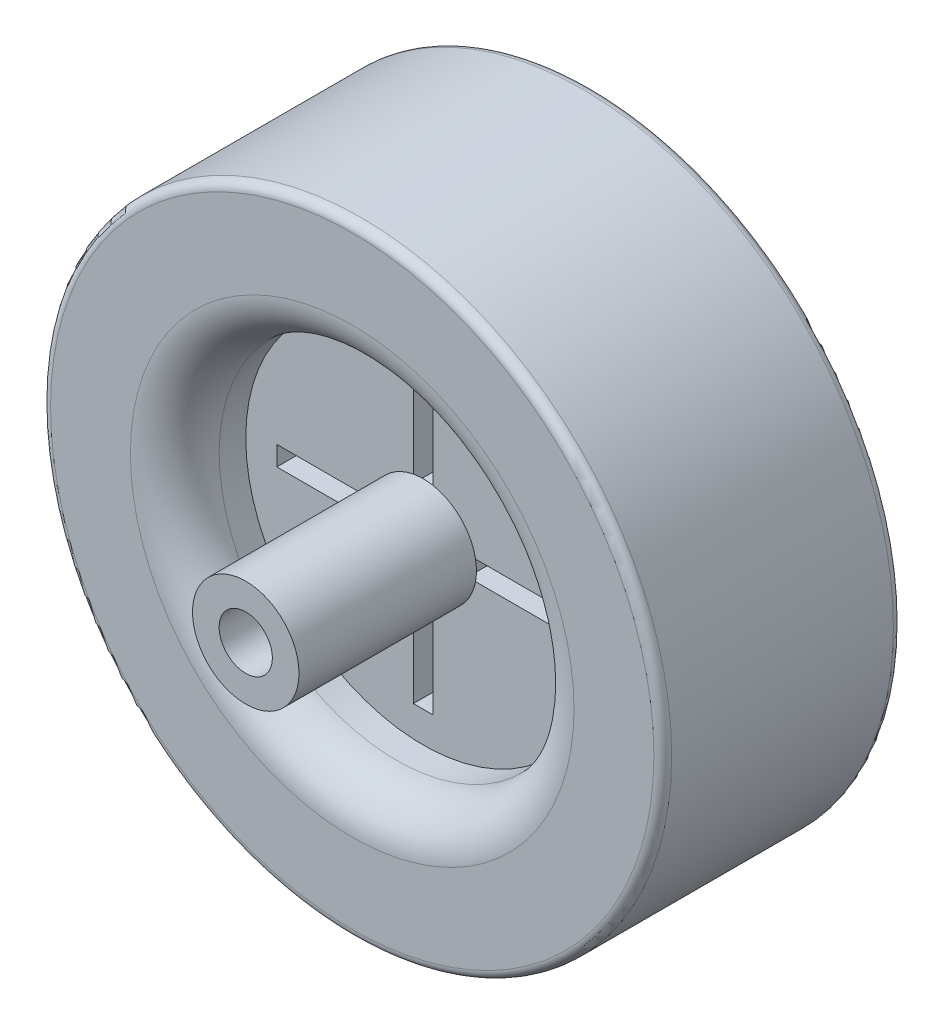
ISO-10303-21;
HEADER;
FILE_DESCRIPTION(('STEP AP214'),'2;1');
FILE_NAME('part.step','',(''),(''),'','','');
FILE_SCHEMA(('AUTOMOTIVE_DESIGN { 1 0 10303 214 1 1 1 1 }'));
ENDSEC;
DATA;
#1=APPLICATION_CONTEXT('core data for automotive mechanical design processes');
#2=APPLICATION_PROTOCOL_DEFINITION('international standard','automotive_design',2000,#1);
#3=PRODUCT_CONTEXT('',#1,'mechanical');
#4=PRODUCT('Part','Part','',(#3));
#5=PRODUCT_RELATED_PRODUCT_CATEGORY('part','',(#4));
#6=PRODUCT_DEFINITION_FORMATION('','',#4);
#7=PRODUCT_DEFINITION_CONTEXT('part definition',#1,'design');
#8=PRODUCT_DEFINITION('design','',#6,#7);
#9=PRODUCT_DEFINITION_SHAPE('','',#8);
#10=(LENGTH_UNIT() NAMED_UNIT(*) SI_UNIT(.MILLI.,.METRE.));
#11=(NAMED_UNIT(*) PLANE_ANGLE_UNIT() SI_UNIT($,.RADIAN.));
#12=(NAMED_UNIT(*) SI_UNIT($,.STERADIAN.) SOLID_ANGLE_UNIT());
#13=UNCERTAINTY_MEASURE_WITH_UNIT(LENGTH_MEASURE(1.E-05),#10,'distance_accuracy_value','');
#14=(GEOMETRIC_REPRESENTATION_CONTEXT(3) GLOBAL_UNCERTAINTY_ASSIGNED_CONTEXT((#13)) GLOBAL_UNIT_ASSIGNED_CONTEXT((#10,
#11,#12)) REPRESENTATION_CONTEXT('',''));
#15=CARTESIAN_POINT('',(0.,0.,0.));
#16=DIRECTION('',(0.,0.,1.));
#17=DIRECTION('',(1.,0.,0.));
#18=AXIS2_PLACEMENT_3D('',#15,#16,#17);
#19=CARTESIAN_POINT('',(0.,0.,19.));
#20=DIRECTION('',(0.,0.,1.));
#21=DIRECTION('',(1.,0.,0.));
#22=AXIS2_PLACEMENT_3D('',#19,#20,#21);
#23=PLANE('',#22);
#24=CARTESIAN_POINT('',(0.,0.,19.));
#25=DIRECTION('',(0.,0.,1.));
#26=DIRECTION('',(1.,0.,0.));
#27=AXIS2_PLACEMENT_3D('',#24,#25,#26);
#28=CIRCLE('',#27,20.);
#29=CARTESIAN_POINT('',(20.,0.,19.));
#30=VERTEX_POINT('',#29);
#31=EDGE_CURVE('E335',#30,#30,#28,.T.);
#32=ORIENTED_EDGE('',*,*,#31,.T.);
#33=EDGE_LOOP('',(#32));
#34=FACE_BOUND('',#33,.T.);
#35=CARTESIAN_POINT('',(0.,0.,19.));
#36=DIRECTION('',(0.,0.,1.));
#37=DIRECTION('',(1.,0.,0.));
#38=AXIS2_PLACEMENT_3D('',#35,#36,#37);
#39=CIRCLE('',#38,6.);
#40=CARTESIAN_POINT('',(1.09999999999999,-5.89830484122345,19.));
#41=VERTEX_POINT('',#40);
#42=CARTESIAN_POINT('',(5.89830484122345,-1.10000000000001,19.));
#43=VERTEX_POINT('',#42);
#44=EDGE_CURVE('E203',#41,#43,#39,.T.);
#45=ORIENTED_EDGE('',*,*,#44,.F.);
#46=DIRECTION('',(0.,-1.,0.));
#47=VECTOR('',#46,1.);
#48=CARTESIAN_POINT('',(1.09999999999999,-16.5,19.));
#49=LINE('',#48,#47);
#50=CARTESIAN_POINT('',(1.09999999999999,-16.5,19.));
#51=VERTEX_POINT('',#50);
#52=EDGE_CURVE('E183',#41,#51,#49,.T.);
#53=ORIENTED_EDGE('',*,*,#52,.T.);
#54=DIRECTION('',(-1.,0.,0.));
#55=VECTOR('',#54,1.);
#56=CARTESIAN_POINT('',(1.09999999999999,-16.5,19.));
#57=LINE('',#56,#55);
#58=CARTESIAN_POINT('',(-1.1,-16.5,19.));
#59=VERTEX_POINT('',#58);
#60=EDGE_CURVE('E194',#51,#59,#57,.T.);
#61=ORIENTED_EDGE('',*,*,#60,.T.);
#62=DIRECTION('',(0.,1.,0.));
#63=VECTOR('',#62,1.);
#64=CARTESIAN_POINT('',(-1.1,-16.5,19.));
#65=LINE('',#64,#63);
#66=CARTESIAN_POINT('',(-1.1,-5.89830484122345,19.));
#67=VERTEX_POINT('',#66);
#68=EDGE_CURVE('E56',#59,#67,#65,.T.);
#69=ORIENTED_EDGE('',*,*,#68,.T.);
#70=CARTESIAN_POINT('',(-5.89830484122346,-1.09999999999995,19.));
#71=VERTEX_POINT('',#70);
#72=EDGE_CURVE('E480',#71,#67,#39,.T.);
#73=ORIENTED_EDGE('',*,*,#72,.F.);
#74=DIRECTION('',(-1.,0.,0.));
#75=VECTOR('',#74,1.);
#76=CARTESIAN_POINT('',(-16.5,-1.09999999999983,19.));
#77=LINE('',#76,#75);
#78=CARTESIAN_POINT('',(-16.5,-1.09999999999983,19.));
#79=VERTEX_POINT('',#78);
#80=EDGE_CURVE('E235',#71,#79,#77,.T.);
#81=ORIENTED_EDGE('',*,*,#80,.T.);
#82=DIRECTION('',(0.,1.,0.));
#83=VECTOR('',#82,1.);
#84=CARTESIAN_POINT('',(-16.5,1.10000000000017,19.));
#85=LINE('',#84,#83);
#86=CARTESIAN_POINT('',(-16.5,1.10000000000017,19.));
#87=VERTEX_POINT('',#86);
#88=EDGE_CURVE('E64',#79,#87,#85,.T.);
#89=ORIENTED_EDGE('',*,*,#88,.T.);
#90=DIRECTION('',(1.,0.,0.));
#91=VECTOR('',#90,1.);
#92=CARTESIAN_POINT('',(-16.5,1.10000000000017,19.));
#93=LINE('',#92,#91);
#94=CARTESIAN_POINT('',(-5.89830484122344,1.10000000000005,19.));
#95=VERTEX_POINT('',#94);
#96=EDGE_CURVE('E228',#87,#95,#93,.T.);
#97=ORIENTED_EDGE('',*,*,#96,.T.);
#98=CARTESIAN_POINT('',(-1.1,5.89830484122345,19.));
#99=VERTEX_POINT('',#98);
#100=EDGE_CURVE('E477',#99,#95,#39,.T.);
#101=ORIENTED_EDGE('',*,*,#100,.F.);
#102=DIRECTION('',(0.,1.,0.));
#103=VECTOR('',#102,1.);
#104=CARTESIAN_POINT('',(-1.1,16.5,19.));
#105=LINE('',#104,#103);
#106=CARTESIAN_POINT('',(-1.1,16.5,19.));
#107=VERTEX_POINT('',#106);
#108=EDGE_CURVE('E267',#99,#107,#105,.T.);
#109=ORIENTED_EDGE('',*,*,#108,.T.);
#110=DIRECTION('',(1.,0.,0.));
#111=VECTOR('',#110,1.);
#112=CARTESIAN_POINT('',(1.09999999999999,16.5,19.));
#113=LINE('',#112,#111);
#114=CARTESIAN_POINT('',(1.09999999999999,16.5,19.));
#115=VERTEX_POINT('',#114);
#116=EDGE_CURVE('E271',#107,#115,#113,.T.);
#117=ORIENTED_EDGE('',*,*,#116,.T.);
#118=DIRECTION('',(0.,-1.,0.));
#119=VECTOR('',#118,1.);
#120=CARTESIAN_POINT('',(1.09999999999999,16.5,19.));
#121=LINE('',#120,#119);
#122=CARTESIAN_POINT('',(1.09999999999999,5.89830484122345,19.));
#123=VERTEX_POINT('',#122);
#124=EDGE_CURVE('E260',#115,#123,#121,.T.);
#125=ORIENTED_EDGE('',*,*,#124,.T.);
#126=CARTESIAN_POINT('',(5.89830484122346,1.09999999999998,19.));
#127=VERTEX_POINT('',#126);
#128=EDGE_CURVE('E336',#127,#123,#39,.T.);
#129=ORIENTED_EDGE('',*,*,#128,.F.);
#130=DIRECTION('',(1.,0.,0.));
#131=VECTOR('',#130,1.);
#132=CARTESIAN_POINT('',(16.5,1.09999999999995,19.));
#133=LINE('',#132,#131);
#134=CARTESIAN_POINT('',(16.5,1.09999999999995,19.));
#135=VERTEX_POINT('',#134);
#136=EDGE_CURVE('E300',#127,#135,#133,.T.);
#137=ORIENTED_EDGE('',*,*,#136,.T.);
#138=DIRECTION('',(0.,-1.,0.));
#139=VECTOR('',#138,1.);
#140=CARTESIAN_POINT('',(16.5,-1.10000000000005,19.));
#141=LINE('',#140,#139);
#142=CARTESIAN_POINT('',(16.5,-1.10000000000005,19.));
#143=VERTEX_POINT('',#142);
#144=EDGE_CURVE('E304',#135,#143,#141,.T.);
#145=ORIENTED_EDGE('',*,*,#144,.T.);
#146=DIRECTION('',(-1.,0.,0.));
#147=VECTOR('',#146,1.);
#148=CARTESIAN_POINT('',(16.5,-1.10000000000005,19.));
#149=LINE('',#148,#147);
#150=EDGE_CURVE('E294',#143,#43,#149,.T.);
#151=ORIENTED_EDGE('',*,*,#150,.T.);
#152=EDGE_LOOP('',(#45,#53,#61,#69,#73,#81,#89,#97,#101,#109,#117,#125,#129,#137,#145,#151));
#153=FACE_BOUND('',#152,.T.);
#154=ADVANCED_FACE('F41',(#34,#153),#23,.T.);
#155=CARTESIAN_POINT('',(0.,0.,27.));
#156=DIRECTION('',(0.,0.,-1.));
#157=DIRECTION('',(-1.,0.,0.));
#158=AXIS2_PLACEMENT_3D('',#155,#156,#157);
#159=CYLINDRICAL_SURFACE('',#158,35.);
#160=CARTESIAN_POINT('',(0.,0.,26.));
#161=DIRECTION('',(0.,0.,1.));
#162=DIRECTION('',(1.,0.,0.));
#163=AXIS2_PLACEMENT_3D('',#160,#161,#162);
#164=CIRCLE('',#163,35.);
#165=CARTESIAN_POINT('',(35.,0.,26.));
#166=VERTEX_POINT('',#165);
#167=EDGE_CURVE('E49',#166,#166,#164,.F.);
#168=ORIENTED_EDGE('',*,*,#167,.T.);
#169=EDGE_LOOP('',(#168));
#170=FACE_BOUND('',#169,.T.);
#171=CARTESIAN_POINT('',(0.,0.,1.));
#172=DIRECTION('',(0.,0.,1.));
#173=DIRECTION('',(1.,0.,0.));
#174=AXIS2_PLACEMENT_3D('',#171,#172,#173);
#175=CIRCLE('',#174,35.);
#176=CARTESIAN_POINT('',(35.,0.,1.));
#177=VERTEX_POINT('',#176);
#178=EDGE_CURVE('E357',#177,#177,#175,.T.);
#179=ORIENTED_EDGE('',*,*,#178,.T.);
#180=EDGE_LOOP('',(#179));
#181=FACE_BOUND('',#180,.T.);
#182=ADVANCED_FACE('F368',(#170,#181),#159,.T.);
#183=CARTESIAN_POINT('',(0.,0.,27.));
#184=DIRECTION('',(0.,0.,1.));
#185=DIRECTION('',(1.,0.,0.));
#186=AXIS2_PLACEMENT_3D('',#183,#184,#185);
#187=PLANE('',#186);
#188=CARTESIAN_POINT('',(0.,0.,27.));
#189=DIRECTION('',(0.,0.,1.));
#190=DIRECTION('',(1.,0.,0.));
#191=AXIS2_PLACEMENT_3D('',#188,#189,#190);
#192=CIRCLE('',#191,34.);
#193=CARTESIAN_POINT('',(34.,0.,27.));
#194=VERTEX_POINT('',#193);
#195=EDGE_CURVE('E363',#194,#194,#192,.T.);
#196=ORIENTED_EDGE('',*,*,#195,.T.);
#197=EDGE_LOOP('',(#196));
#198=FACE_BOUND('',#197,.T.);
#199=CARTESIAN_POINT('',(0.,0.,27.));
#200=DIRECTION('',(0.,0.,1.));
#201=DIRECTION('',(1.,0.,0.));
#202=AXIS2_PLACEMENT_3D('',#199,#200,#201);
#203=CIRCLE('',#202,25.);
#204=CARTESIAN_POINT('',(25.,0.,27.));
#205=VERTEX_POINT('',#204);
#206=EDGE_CURVE('E354',#205,#205,#203,.F.);
#207=ORIENTED_EDGE('',*,*,#206,.T.);
#208=EDGE_LOOP('',(#207));
#209=FACE_BOUND('',#208,.T.);
#210=ADVANCED_FACE('F378',(#198,#209),#187,.T.);
#211=CARTESIAN_POINT('',(0.,0.,0.));
#212=DIRECTION('',(0.,0.,1.));
#213=DIRECTION('',(1.,0.,0.));
#214=AXIS2_PLACEMENT_3D('',#211,#212,#213);
#215=PLANE('',#214);
#216=CARTESIAN_POINT('',(0.,0.,0.));
#217=DIRECTION('',(0.,0.,1.));
#218=DIRECTION('',(1.,0.,0.));
#219=AXIS2_PLACEMENT_3D('',#216,#217,#218);
#220=CIRCLE('',#219,34.);
#221=CARTESIAN_POINT('',(34.,0.,0.));
#222=VERTEX_POINT('',#221);
#223=EDGE_CURVE('E360',#222,#222,#220,.F.);
#224=ORIENTED_EDGE('',*,*,#223,.T.);
#225=EDGE_LOOP('',(#224));
#226=FACE_BOUND('',#225,.T.);
#227=CARTESIAN_POINT('',(0.,0.,0.));
#228=DIRECTION('',(0.,0.,1.));
#229=DIRECTION('',(1.,0.,0.));
#230=AXIS2_PLACEMENT_3D('',#227,#228,#229);
#231=CIRCLE('',#230,25.);
#232=CARTESIAN_POINT('',(25.,0.,0.));
#233=VERTEX_POINT('',#232);
#234=EDGE_CURVE('E348',#233,#233,#231,.T.);
#235=ORIENTED_EDGE('',*,*,#234,.T.);
#236=EDGE_LOOP('',(#235));
#237=FACE_BOUND('',#236,.T.);
#238=ADVANCED_FACE('F381',(#226,#237),#215,.F.);
#239=CARTESIAN_POINT('',(0.,0.,8.));
#240=DIRECTION('',(0.,0.,-1.));
#241=DIRECTION('',(-1.,0.,0.));
#242=AXIS2_PLACEMENT_3D('',#239,#240,#241);
#243=CYLINDRICAL_SURFACE('',#242,20.);
#244=CARTESIAN_POINT('',(0.,0.,5.));
#245=DIRECTION('',(0.,0.,1.));
#246=DIRECTION('',(1.,0.,0.));
#247=AXIS2_PLACEMENT_3D('',#244,#245,#246);
#248=CIRCLE('',#247,20.);
#249=CARTESIAN_POINT('',(20.,0.,5.));
#250=VERTEX_POINT('',#249);
#251=EDGE_CURVE('E345',#250,#250,#248,.F.);
#252=ORIENTED_EDGE('',*,*,#251,.T.);
#253=EDGE_LOOP('',(#252));
#254=FACE_BOUND('',#253,.T.);
#255=CARTESIAN_POINT('',(0.,0.,8.));
#256=DIRECTION('',(0.,0.,-1.));
#257=DIRECTION('',(-1.,0.,0.));
#258=AXIS2_PLACEMENT_3D('',#255,#256,#257);
#259=CIRCLE('',#258,20.);
#260=CARTESIAN_POINT('',(-20.,0.,8.));
#261=VERTEX_POINT('',#260);
#262=EDGE_CURVE('E342',#261,#261,#259,.T.);
#263=ORIENTED_EDGE('',*,*,#262,.F.);
#264=EDGE_LOOP('',(#263));
#265=FACE_BOUND('',#264,.T.);
#266=ADVANCED_FACE('F412',(#254,#265),#243,.F.);
#267=CARTESIAN_POINT('',(0.,0.,8.));
#268=DIRECTION('',(0.,0.,-1.));
#269=DIRECTION('',(-1.,0.,0.));
#270=AXIS2_PLACEMENT_3D('',#267,#268,#269);
#271=PLANE('',#270);
#272=CARTESIAN_POINT('',(0.,0.,8.));
#273=DIRECTION('',(0.,0.,-1.));
#274=DIRECTION('',(-1.,0.,0.));
#275=AXIS2_PLACEMENT_3D('',#272,#273,#274);
#276=CIRCLE('',#275,2.);
#277=CARTESIAN_POINT('',(-2.,0.,8.));
#278=VERTEX_POINT('',#277);
#279=EDGE_CURVE('E211',#278,#278,#276,.T.);
#280=ORIENTED_EDGE('',*,*,#279,.F.);
#281=EDGE_LOOP('',(#280));
#282=FACE_BOUND('',#281,.T.);
#283=DIRECTION('',(0.,-1.,0.));
#284=VECTOR('',#283,1.);
#285=CARTESIAN_POINT('',(1.09999999999999,-16.5,8.));
#286=LINE('',#285,#284);
#287=CARTESIAN_POINT('',(1.09999999999999,-5.,8.));
#288=VERTEX_POINT('',#287);
#289=CARTESIAN_POINT('',(1.09999999999999,-16.5,8.));
#290=VERTEX_POINT('',#289);
#291=EDGE_CURVE('E186',#288,#290,#286,.T.);
#292=ORIENTED_EDGE('',*,*,#291,.F.);
#293=DIRECTION('',(1.,0.,0.));
#294=VECTOR('',#293,1.);
#295=CARTESIAN_POINT('',(1.09999999999999,-5.,8.));
#296=LINE('',#295,#294);
#297=CARTESIAN_POINT('',(-1.1,-5.,8.));
#298=VERTEX_POINT('',#297);
#299=EDGE_CURVE('E205',#298,#288,#296,.T.);
#300=ORIENTED_EDGE('',*,*,#299,.F.);
#301=DIRECTION('',(0.,1.,0.));
#302=VECTOR('',#301,1.);
#303=CARTESIAN_POINT('',(-1.1,-16.5,8.));
#304=LINE('',#303,#302);
#305=CARTESIAN_POINT('',(-1.1,-16.5,8.));
#306=VERTEX_POINT('',#305);
#307=EDGE_CURVE('E208',#306,#298,#304,.T.);
#308=ORIENTED_EDGE('',*,*,#307,.F.);
#309=DIRECTION('',(-1.,0.,0.));
#310=VECTOR('',#309,1.);
#311=CARTESIAN_POINT('',(1.09999999999999,-16.5,8.));
#312=LINE('',#311,#310);
#313=EDGE_CURVE('E217',#290,#306,#312,.T.);
#314=ORIENTED_EDGE('',*,*,#313,.F.);
#315=EDGE_LOOP('',(#292,#300,#308,#314));
#316=FACE_BOUND('',#315,.T.);
#317=DIRECTION('',(1.,0.,0.));
#318=VECTOR('',#317,1.);
#319=CARTESIAN_POINT('',(-16.5,1.10000000000017,8.));
#320=LINE('',#319,#318);
#321=CARTESIAN_POINT('',(-16.5,1.10000000000017,8.));
#322=VERTEX_POINT('',#321);
#323=CARTESIAN_POINT('',(-4.99999999999999,1.10000000000005,8.));
#324=VERTEX_POINT('',#323);
#325=EDGE_CURVE('E241',#322,#324,#320,.T.);
#326=ORIENTED_EDGE('',*,*,#325,.F.);
#327=DIRECTION('',(0.,1.,0.));
#328=VECTOR('',#327,1.);
#329=CARTESIAN_POINT('',(-16.5,1.10000000000017,8.));
#330=LINE('',#329,#328);
#331=CARTESIAN_POINT('',(-16.5,-1.09999999999983,8.));
#332=VERTEX_POINT('',#331);
#333=EDGE_CURVE('E250',#332,#322,#330,.T.);
#334=ORIENTED_EDGE('',*,*,#333,.F.);
#335=DIRECTION('',(-1.,0.,0.));
#336=VECTOR('',#335,1.);
#337=CARTESIAN_POINT('',(-16.5,-1.09999999999983,8.));
#338=LINE('',#337,#336);
#339=CARTESIAN_POINT('',(-5.00000000000002,-1.09999999999996,8.));
#340=VERTEX_POINT('',#339);
#341=EDGE_CURVE('E247',#340,#332,#338,.T.);
#342=ORIENTED_EDGE('',*,*,#341,.F.);
#343=DIRECTION('',(0.,-1.,0.));
#344=VECTOR('',#343,1.);
#345=CARTESIAN_POINT('',(-4.99999999999999,1.10000000000005,8.));
#346=LINE('',#345,#344);
#347=EDGE_CURVE('E243',#324,#340,#346,.T.);
#348=ORIENTED_EDGE('',*,*,#347,.F.);
#349=EDGE_LOOP('',(#326,#334,#342,#348));
#350=FACE_BOUND('',#349,.T.);
#351=DIRECTION('',(0.,-1.,0.));
#352=VECTOR('',#351,1.);
#353=CARTESIAN_POINT('',(1.09999999999999,16.5,8.));
#354=LINE('',#353,#352);
#355=CARTESIAN_POINT('',(1.09999999999999,16.5,8.));
#356=VERTEX_POINT('',#355);
#357=CARTESIAN_POINT('',(1.09999999999999,5.,8.));
#358=VERTEX_POINT('',#357);
#359=EDGE_CURVE('E275',#356,#358,#354,.T.);
#360=ORIENTED_EDGE('',*,*,#359,.F.);
#361=DIRECTION('',(1.,0.,0.));
#362=VECTOR('',#361,1.);
#363=CARTESIAN_POINT('',(1.09999999999999,16.5,8.));
#364=LINE('',#363,#362);
#365=CARTESIAN_POINT('',(-1.1,16.5,8.));
#366=VERTEX_POINT('',#365);
#367=EDGE_CURVE('E284',#366,#356,#364,.T.);
#368=ORIENTED_EDGE('',*,*,#367,.F.);
#369=DIRECTION('',(0.,1.,0.));
#370=VECTOR('',#369,1.);
#371=CARTESIAN_POINT('',(-1.1,16.5,8.));
#372=LINE('',#371,#370);
#373=CARTESIAN_POINT('',(-1.1,5.,8.));
#374=VERTEX_POINT('',#373);
#375=EDGE_CURVE('E281',#374,#366,#372,.T.);
#376=ORIENTED_EDGE('',*,*,#375,.F.);
#377=DIRECTION('',(-1.,0.,0.));
#378=VECTOR('',#377,1.);
#379=CARTESIAN_POINT('',(1.09999999999999,5.,8.));
#380=LINE('',#379,#378);
#381=EDGE_CURVE('E277',#358,#374,#380,.T.);
#382=ORIENTED_EDGE('',*,*,#381,.F.);
#383=EDGE_LOOP('',(#360,#368,#376,#382));
#384=FACE_BOUND('',#383,.T.);
#385=DIRECTION('',(-1.,0.,0.));
#386=VECTOR('',#385,1.);
#387=CARTESIAN_POINT('',(16.5,-1.10000000000005,8.));
#388=LINE('',#387,#386);
#389=CARTESIAN_POINT('',(16.5,-1.10000000000005,8.));
#390=VERTEX_POINT('',#389);
#391=CARTESIAN_POINT('',(5.,-1.10000000000001,8.));
#392=VERTEX_POINT('',#391);
#393=EDGE_CURVE('E308',#390,#392,#388,.T.);
#394=ORIENTED_EDGE('',*,*,#393,.F.);
#395=DIRECTION('',(0.,-1.,0.));
#396=VECTOR('',#395,1.);
#397=CARTESIAN_POINT('',(16.5,-1.10000000000005,8.));
#398=LINE('',#397,#396);
#399=CARTESIAN_POINT('',(16.5,1.09999999999995,8.));
#400=VERTEX_POINT('',#399);
#401=EDGE_CURVE('E316',#400,#390,#398,.T.);
#402=ORIENTED_EDGE('',*,*,#401,.F.);
#403=DIRECTION('',(1.,0.,0.));
#404=VECTOR('',#403,1.);
#405=CARTESIAN_POINT('',(16.5,1.09999999999995,8.));
#406=LINE('',#405,#404);
#407=CARTESIAN_POINT('',(5.00000000000001,1.09999999999999,8.));
#408=VERTEX_POINT('',#407);
#409=EDGE_CURVE('E313',#408,#400,#406,.T.);
#410=ORIENTED_EDGE('',*,*,#409,.F.);
#411=DIRECTION('',(0.,1.,0.));
#412=VECTOR('',#411,1.);
#413=CARTESIAN_POINT('',(5.,-1.10000000000001,8.));
#414=LINE('',#413,#412);
#415=EDGE_CURVE('E310',#392,#408,#414,.T.);
#416=ORIENTED_EDGE('',*,*,#415,.F.);
#417=EDGE_LOOP('',(#394,#402,#410,#416));
#418=FACE_BOUND('',#417,.T.);
#419=ORIENTED_EDGE('',*,*,#262,.T.);
#420=EDGE_LOOP('',(#419));
#421=FACE_BOUND('',#420,.T.);
#422=ADVANCED_FACE('F396',(#282,#316,#350,#384,#418,#421),#271,.T.);
#423=CARTESIAN_POINT('',(0.,0.,19.));
#424=DIRECTION('',(0.,0.,1.));
#425=DIRECTION('',(1.,0.,0.));
#426=AXIS2_PLACEMENT_3D('',#423,#424,#425);
#427=CYLINDRICAL_SURFACE('',#426,20.);
#428=CARTESIAN_POINT('',(0.,0.,22.));
#429=DIRECTION('',(0.,0.,1.));
#430=DIRECTION('',(1.,0.,0.));
#431=AXIS2_PLACEMENT_3D('',#428,#429,#430);
#432=CIRCLE('',#431,20.);
#433=CARTESIAN_POINT('',(20.,0.,22.));
#434=VERTEX_POINT('',#433);
#435=EDGE_CURVE('E351',#434,#434,#432,.T.);
#436=ORIENTED_EDGE('',*,*,#435,.T.);
#437=EDGE_LOOP('',(#436));
#438=FACE_BOUND('',#437,.T.);
#439=ORIENTED_EDGE('',*,*,#31,.F.);
#440=EDGE_LOOP('',(#439));
#441=FACE_BOUND('',#440,.T.);
#442=ADVANCED_FACE('F393',(#438,#441),#427,.F.);
#443=CARTESIAN_POINT('',(0.,0.,5.));
#444=DIRECTION('',(0.,0.,1.));
#445=DIRECTION('',(1.,0.,0.));
#446=AXIS2_PLACEMENT_3D('',#443,#444,#445);
#447=TOROIDAL_SURFACE('',#446,25.,5.);
#448=ORIENTED_EDGE('',*,*,#234,.F.);
#449=EDGE_LOOP('',(#448));
#450=FACE_BOUND('',#449,.T.);
#451=ORIENTED_EDGE('',*,*,#251,.F.);
#452=EDGE_LOOP('',(#451));
#453=FACE_BOUND('',#452,.T.);
#454=ADVANCED_FACE('F389',(#450,#453),#447,.T.);
#455=CARTESIAN_POINT('',(0.,0.,22.));
#456=DIRECTION('',(0.,0.,1.));
#457=DIRECTION('',(1.,0.,0.));
#458=AXIS2_PLACEMENT_3D('',#455,#456,#457);
#459=TOROIDAL_SURFACE('',#458,25.,5.);
#460=ORIENTED_EDGE('',*,*,#206,.F.);
#461=EDGE_LOOP('',(#460));
#462=FACE_BOUND('',#461,.T.);
#463=ORIENTED_EDGE('',*,*,#435,.F.);
#464=EDGE_LOOP('',(#463));
#465=FACE_BOUND('',#464,.T.);
#466=ADVANCED_FACE('F385',(#462,#465),#459,.T.);
#467=CARTESIAN_POINT('',(0.,0.,39.));
#468=DIRECTION('',(0.,0.,-1.));
#469=DIRECTION('',(-1.,0.,0.));
#470=AXIS2_PLACEMENT_3D('',#467,#468,#469);
#471=CYLINDRICAL_SURFACE('',#470,6.);
#472=CARTESIAN_POINT('',(0.,0.,39.));
#473=DIRECTION('',(0.,0.,1.));
#474=DIRECTION('',(1.,0.,0.));
#475=AXIS2_PLACEMENT_3D('',#472,#473,#474);
#476=CIRCLE('',#475,6.);
#477=CARTESIAN_POINT('',(6.,0.,39.));
#478=VERTEX_POINT('',#477);
#479=EDGE_CURVE('E332',#478,#478,#476,.T.);
#480=ORIENTED_EDGE('',*,*,#479,.F.);
#481=EDGE_LOOP('',(#480));
#482=FACE_BOUND('',#481,.T.);
#483=ORIENTED_EDGE('',*,*,#128,.T.);
#484=EDGE_CURVE('E339',#123,#99,#39,.T.);
#485=ORIENTED_EDGE('',*,*,#484,.T.);
#486=ORIENTED_EDGE('',*,*,#100,.T.);
#487=EDGE_CURVE('E478',#95,#71,#39,.T.);
#488=ORIENTED_EDGE('',*,*,#487,.T.);
#489=ORIENTED_EDGE('',*,*,#72,.T.);
#490=EDGE_CURVE('E482',#67,#41,#39,.T.);
#491=ORIENTED_EDGE('',*,*,#490,.T.);
#492=ORIENTED_EDGE('',*,*,#44,.T.);
#493=EDGE_CURVE('E329',#43,#127,#39,.T.);
#494=ORIENTED_EDGE('',*,*,#493,.T.);
#495=EDGE_LOOP('',(#483,#485,#486,#488,#489,#491,#492,#494));
#496=FACE_BOUND('',#495,.T.);
#497=ADVANCED_FACE('F388',(#482,#496),#471,.T.);
#498=CARTESIAN_POINT('',(0.,0.,39.));
#499=DIRECTION('',(0.,0.,1.));
#500=DIRECTION('',(1.,0.,0.));
#501=AXIS2_PLACEMENT_3D('',#498,#499,#500);
#502=PLANE('',#501);
#503=CARTESIAN_POINT('',(0.,0.,39.));
#504=DIRECTION('',(0.,0.,1.));
#505=DIRECTION('',(1.,0.,0.));
#506=AXIS2_PLACEMENT_3D('',#503,#504,#505);
#507=CIRCLE('',#506,3.);
#508=CARTESIAN_POINT('',(3.,0.,39.));
#509=VERTEX_POINT('',#508);
#510=EDGE_CURVE('E224',#509,#509,#507,.T.);
#511=ORIENTED_EDGE('',*,*,#510,.F.);
#512=EDGE_LOOP('',(#511));
#513=FACE_BOUND('',#512,.T.);
#514=ORIENTED_EDGE('',*,*,#479,.T.);
#515=EDGE_LOOP('',(#514));
#516=FACE_BOUND('',#515,.T.);
#517=ADVANCED_FACE('F446',(#513,#516),#502,.T.);
#518=CARTESIAN_POINT('',(0.,0.,33.));
#519=DIRECTION('',(0.,0.,1.));
#520=DIRECTION('',(1.,0.,0.));
#521=AXIS2_PLACEMENT_3D('',#518,#519,#520);
#522=CYLINDRICAL_SURFACE('',#521,3.);
#523=CARTESIAN_POINT('',(0.,0.,33.));
#524=DIRECTION('',(0.,0.,1.));
#525=DIRECTION('',(1.,0.,0.));
#526=AXIS2_PLACEMENT_3D('',#523,#524,#525);
#527=CIRCLE('',#526,3.);
#528=CARTESIAN_POINT('',(3.,0.,33.));
#529=VERTEX_POINT('',#528);
#530=EDGE_CURVE('E326',#529,#529,#527,.T.);
#531=ORIENTED_EDGE('',*,*,#530,.F.);
#532=EDGE_LOOP('',(#531));
#533=FACE_BOUND('',#532,.T.);
#534=ORIENTED_EDGE('',*,*,#510,.T.);
#535=EDGE_LOOP('',(#534));
#536=FACE_BOUND('',#535,.T.);
#537=ADVANCED_FACE('F430',(#533,#536),#522,.F.);
#538=CARTESIAN_POINT('',(0.,0.,33.));
#539=DIRECTION('',(0.,0.,1.));
#540=DIRECTION('',(1.,0.,0.));
#541=AXIS2_PLACEMENT_3D('',#538,#539,#540);
#542=PLANE('',#541);
#543=ORIENTED_EDGE('',*,*,#530,.T.);
#544=EDGE_LOOP('',(#543));
#545=FACE_BOUND('',#544,.T.);
#546=ADVANCED_FACE('F424',(#545),#542,.T.);
#547=CARTESIAN_POINT('',(0.,0.,1.));
#548=DIRECTION('',(0.,0.,1.));
#549=DIRECTION('',(1.,0.,0.));
#550=AXIS2_PLACEMENT_3D('',#547,#548,#549);
#551=TOROIDAL_SURFACE('',#550,34.,1.);
#552=ORIENTED_EDGE('',*,*,#223,.F.);
#553=EDGE_LOOP('',(#552));
#554=FACE_BOUND('',#553,.T.);
#555=ORIENTED_EDGE('',*,*,#178,.F.);
#556=EDGE_LOOP('',(#555));
#557=FACE_BOUND('',#556,.T.);
#558=ADVANCED_FACE('F375',(#554,#557),#551,.T.);
#559=CARTESIAN_POINT('',(0.,0.,26.));
#560=DIRECTION('',(0.,0.,1.));
#561=DIRECTION('',(1.,0.,0.));
#562=AXIS2_PLACEMENT_3D('',#559,#560,#561);
#563=TOROIDAL_SURFACE('',#562,34.,1.);
#564=ORIENTED_EDGE('',*,*,#167,.F.);
#565=EDGE_LOOP('',(#564));
#566=FACE_BOUND('',#565,.T.);
#567=ORIENTED_EDGE('',*,*,#195,.F.);
#568=EDGE_LOOP('',(#567));
#569=FACE_BOUND('',#568,.T.);
#570=ADVANCED_FACE('F371',(#566,#569),#563,.T.);
#571=CARTESIAN_POINT('',(16.5,-1.10000000000005,19.));
#572=DIRECTION('',(0.,-1.,0.));
#573=DIRECTION('',(1.,0.,0.));
#574=AXIS2_PLACEMENT_3D('',#571,#572,#573);
#575=PLANE('',#574);
#576=ORIENTED_EDGE('',*,*,#393,.T.);
#577=DIRECTION('',(0.,0.,-1.));
#578=VECTOR('',#577,1.);
#579=CARTESIAN_POINT('',(5.,-1.10000000000001,19.));
#580=LINE('',#579,#578);
#581=CARTESIAN_POINT('',(5.,-1.10000000000001,19.));
#582=VERTEX_POINT('',#581);
#583=EDGE_CURVE('E307',#582,#392,#580,.T.);
#584=ORIENTED_EDGE('',*,*,#583,.F.);
#585=EDGE_CURVE('E297',#43,#582,#149,.T.);
#586=ORIENTED_EDGE('',*,*,#585,.F.);
#587=ORIENTED_EDGE('',*,*,#150,.F.);
#588=DIRECTION('',(0.,0.,-1.));
#589=VECTOR('',#588,1.);
#590=CARTESIAN_POINT('',(16.5,-1.10000000000005,19.));
#591=LINE('',#590,#589);
#592=EDGE_CURVE('E278',#143,#390,#591,.T.);
#593=ORIENTED_EDGE('',*,*,#592,.T.);
#594=EDGE_LOOP('',(#576,#584,#586,#587,#593));
#595=FACE_BOUND('',#594,.T.);
#596=ADVANCED_FACE('F374',(#595),#575,.F.);
#597=CARTESIAN_POINT('',(16.5,-1.10000000000005,19.));
#598=DIRECTION('',(1.,0.,0.));
#599=DIRECTION('',(0.,1.,0.));
#600=AXIS2_PLACEMENT_3D('',#597,#598,#599);
#601=PLANE('',#600);
#602=ORIENTED_EDGE('',*,*,#401,.T.);
#603=ORIENTED_EDGE('',*,*,#592,.F.);
#604=ORIENTED_EDGE('',*,*,#144,.F.);
#605=DIRECTION('',(0.,0.,-1.));
#606=VECTOR('',#605,1.);
#607=CARTESIAN_POINT('',(16.5,1.09999999999995,19.));
#608=LINE('',#607,#606);
#609=EDGE_CURVE('E320',#135,#400,#608,.T.);
#610=ORIENTED_EDGE('',*,*,#609,.T.);
#611=EDGE_LOOP('',(#602,#603,#604,#610));
#612=FACE_BOUND('',#611,.T.);
#613=ADVANCED_FACE('F539',(#612),#601,.F.);
#614=CARTESIAN_POINT('',(16.5,1.09999999999995,19.));
#615=DIRECTION('',(0.,1.,0.));
#616=DIRECTION('',(-1.,0.,0.));
#617=AXIS2_PLACEMENT_3D('',#614,#615,#616);
#618=PLANE('',#617);
#619=ORIENTED_EDGE('',*,*,#409,.T.);
#620=ORIENTED_EDGE('',*,*,#609,.F.);
#621=ORIENTED_EDGE('',*,*,#136,.F.);
#622=CARTESIAN_POINT('',(5.00000000000001,1.09999999999999,19.));
#623=VERTEX_POINT('',#622);
#624=EDGE_CURVE('E301',#623,#127,#133,.T.);
#625=ORIENTED_EDGE('',*,*,#624,.F.);
#626=DIRECTION('',(0.,0.,-1.));
#627=VECTOR('',#626,1.);
#628=CARTESIAN_POINT('',(5.00000000000001,1.09999999999999,19.));
#629=LINE('',#628,#627);
#630=EDGE_CURVE('E322',#623,#408,#629,.T.);
#631=ORIENTED_EDGE('',*,*,#630,.T.);
#632=EDGE_LOOP('',(#619,#620,#621,#625,#631));
#633=FACE_BOUND('',#632,.T.);
#634=ADVANCED_FACE('F542',(#633),#618,.F.);
#635=CARTESIAN_POINT('',(5.,-1.10000000000001,19.));
#636=DIRECTION('',(-1.,0.,0.));
#637=DIRECTION('',(0.,-1.,0.));
#638=AXIS2_PLACEMENT_3D('',#635,#636,#637);
#639=PLANE('',#638);
#640=ORIENTED_EDGE('',*,*,#415,.T.);
#641=ORIENTED_EDGE('',*,*,#630,.F.);
#642=DIRECTION('',(0.,1.,0.));
#643=VECTOR('',#642,1.);
#644=CARTESIAN_POINT('',(5.,-1.10000000000001,19.));
#645=LINE('',#644,#643);
#646=EDGE_CURVE('E296',#582,#623,#645,.T.);
#647=ORIENTED_EDGE('',*,*,#646,.F.);
#648=ORIENTED_EDGE('',*,*,#583,.T.);
#649=EDGE_LOOP('',(#640,#641,#647,#648));
#650=FACE_BOUND('',#649,.T.);
#651=ADVANCED_FACE('F537',(#650),#639,.F.);
#652=CARTESIAN_POINT('',(0.,0.,19.));
#653=DIRECTION('',(0.,0.,-1.));
#654=DIRECTION('',(-1.,0.,0.));
#655=AXIS2_PLACEMENT_3D('',#652,#653,#654);
#656=PLANE('',#655);
#657=ORIENTED_EDGE('',*,*,#585,.T.);
#658=ORIENTED_EDGE('',*,*,#646,.T.);
#659=ORIENTED_EDGE('',*,*,#624,.T.);
#660=ORIENTED_EDGE('',*,*,#493,.F.);
#661=EDGE_LOOP('',(#657,#658,#659,#660));
#662=FACE_BOUND('',#661,.T.);
#663=ADVANCED_FACE('F534',(#662),#656,.T.);
#664=CARTESIAN_POINT('',(1.09999999999999,16.5,19.));
#665=DIRECTION('',(1.,0.,0.));
#666=DIRECTION('',(0.,0.,-1.));
#667=AXIS2_PLACEMENT_3D('',#664,#665,#666);
#668=PLANE('',#667);
#669=ORIENTED_EDGE('',*,*,#359,.T.);
#670=DIRECTION('',(0.,0.,-1.));
#671=VECTOR('',#670,1.);
#672=CARTESIAN_POINT('',(1.09999999999999,5.,19.));
#673=LINE('',#672,#671);
#674=CARTESIAN_POINT('',(1.09999999999999,5.,19.));
#675=VERTEX_POINT('',#674);
#676=EDGE_CURVE('E274',#675,#358,#673,.T.);
#677=ORIENTED_EDGE('',*,*,#676,.F.);
#678=EDGE_CURVE('E264',#123,#675,#121,.T.);
#679=ORIENTED_EDGE('',*,*,#678,.F.);
#680=ORIENTED_EDGE('',*,*,#124,.F.);
#681=DIRECTION('',(0.,0.,-1.));
#682=VECTOR('',#681,1.);
#683=CARTESIAN_POINT('',(1.09999999999999,16.5,19.));
#684=LINE('',#683,#682);
#685=EDGE_CURVE('E244',#115,#356,#684,.T.);
#686=ORIENTED_EDGE('',*,*,#685,.T.);
#687=EDGE_LOOP('',(#669,#677,#679,#680,#686));
#688=FACE_BOUND('',#687,.T.);
#689=ADVANCED_FACE('F470',(#688),#668,.F.);
#690=CARTESIAN_POINT('',(1.09999999999999,16.5,19.));
#691=DIRECTION('',(0.,1.,0.));
#692=DIRECTION('',(0.,0.,1.));
#693=AXIS2_PLACEMENT_3D('',#690,#691,#692);
#694=PLANE('',#693);
#695=ORIENTED_EDGE('',*,*,#367,.T.);
#696=ORIENTED_EDGE('',*,*,#685,.F.);
#697=ORIENTED_EDGE('',*,*,#116,.F.);
#698=DIRECTION('',(0.,0.,-1.));
#699=VECTOR('',#698,1.);
#700=CARTESIAN_POINT('',(-1.1,16.5,19.));
#701=LINE('',#700,#699);
#702=EDGE_CURVE('E288',#107,#366,#701,.T.);
#703=ORIENTED_EDGE('',*,*,#702,.T.);
#704=EDGE_LOOP('',(#695,#696,#697,#703));
#705=FACE_BOUND('',#704,.T.);
#706=ADVANCED_FACE('F516',(#705),#694,.F.);
#707=CARTESIAN_POINT('',(-1.1,16.5,19.));
#708=DIRECTION('',(-1.,0.,0.));
#709=DIRECTION('',(0.,0.,1.));
#710=AXIS2_PLACEMENT_3D('',#707,#708,#709);
#711=PLANE('',#710);
#712=ORIENTED_EDGE('',*,*,#375,.T.);
#713=ORIENTED_EDGE('',*,*,#702,.F.);
#714=ORIENTED_EDGE('',*,*,#108,.F.);
#715=CARTESIAN_POINT('',(-1.1,5.,19.));
#716=VERTEX_POINT('',#715);
#717=EDGE_CURVE('E268',#716,#99,#105,.T.);
#718=ORIENTED_EDGE('',*,*,#717,.F.);
#719=DIRECTION('',(0.,0.,-1.));
#720=VECTOR('',#719,1.);
#721=CARTESIAN_POINT('',(-1.1,5.,19.));
#722=LINE('',#721,#720);
#723=EDGE_CURVE('E290',#716,#374,#722,.T.);
#724=ORIENTED_EDGE('',*,*,#723,.T.);
#725=EDGE_LOOP('',(#712,#713,#714,#718,#724));
#726=FACE_BOUND('',#725,.T.);
#727=ADVANCED_FACE('F512',(#726),#711,.F.);
#728=CARTESIAN_POINT('',(1.09999999999999,5.,19.));
#729=DIRECTION('',(0.,-1.,0.));
#730=DIRECTION('',(0.,0.,-1.));
#731=AXIS2_PLACEMENT_3D('',#728,#729,#730);
#732=PLANE('',#731);
#733=ORIENTED_EDGE('',*,*,#381,.T.);
#734=ORIENTED_EDGE('',*,*,#723,.F.);
#735=DIRECTION('',(-1.,0.,0.));
#736=VECTOR('',#735,1.);
#737=CARTESIAN_POINT('',(1.09999999999999,5.,19.));
#738=LINE('',#737,#736);
#739=EDGE_CURVE('E263',#675,#716,#738,.T.);
#740=ORIENTED_EDGE('',*,*,#739,.F.);
#741=ORIENTED_EDGE('',*,*,#676,.T.);
#742=EDGE_LOOP('',(#733,#734,#740,#741));
#743=FACE_BOUND('',#742,.T.);
#744=ADVANCED_FACE('F521',(#743),#732,.F.);
#745=CARTESIAN_POINT('',(0.,0.,19.));
#746=DIRECTION('',(0.,0.,-1.));
#747=DIRECTION('',(-1.,0.,0.));
#748=AXIS2_PLACEMENT_3D('',#745,#746,#747);
#749=PLANE('',#748);
#750=ORIENTED_EDGE('',*,*,#678,.T.);
#751=ORIENTED_EDGE('',*,*,#739,.T.);
#752=ORIENTED_EDGE('',*,*,#717,.T.);
#753=ORIENTED_EDGE('',*,*,#484,.F.);
#754=EDGE_LOOP('',(#750,#751,#752,#753));
#755=FACE_BOUND('',#754,.T.);
#756=ADVANCED_FACE('F474',(#755),#749,.T.);
#757=CARTESIAN_POINT('',(-16.5,1.10000000000017,19.));
#758=DIRECTION('',(0.,1.,0.));
#759=DIRECTION('',(-1.,0.,0.));
#760=AXIS2_PLACEMENT_3D('',#757,#758,#759);
#761=PLANE('',#760);
#762=ORIENTED_EDGE('',*,*,#325,.T.);
#763=DIRECTION('',(0.,0.,-1.));
#764=VECTOR('',#763,1.);
#765=CARTESIAN_POINT('',(-4.99999999999999,1.10000000000005,19.));
#766=LINE('',#765,#764);
#767=CARTESIAN_POINT('',(-4.99999999999999,1.10000000000005,19.));
#768=VERTEX_POINT('',#767);
#769=EDGE_CURVE('E240',#768,#324,#766,.T.);
#770=ORIENTED_EDGE('',*,*,#769,.F.);
#771=EDGE_CURVE('E232',#95,#768,#93,.T.);
#772=ORIENTED_EDGE('',*,*,#771,.F.);
#773=ORIENTED_EDGE('',*,*,#96,.F.);
#774=DIRECTION('',(0.,0.,-1.));
#775=VECTOR('',#774,1.);
#776=CARTESIAN_POINT('',(-16.5,1.10000000000017,19.));
#777=LINE('',#776,#775);
#778=EDGE_CURVE('E218',#87,#322,#777,.T.);
#779=ORIENTED_EDGE('',*,*,#778,.T.);
#780=EDGE_LOOP('',(#762,#770,#772,#773,#779));
#781=FACE_BOUND('',#780,.T.);
#782=ADVANCED_FACE('F509',(#781),#761,.F.);
#783=CARTESIAN_POINT('',(-16.5,1.10000000000017,19.));
#784=DIRECTION('',(-1.,0.,0.));
#785=DIRECTION('',(0.,-1.,0.));
#786=AXIS2_PLACEMENT_3D('',#783,#784,#785);
#787=PLANE('',#786);
#788=ORIENTED_EDGE('',*,*,#333,.T.);
#789=ORIENTED_EDGE('',*,*,#778,.F.);
#790=ORIENTED_EDGE('',*,*,#88,.F.);
#791=DIRECTION('',(0.,0.,-1.));
#792=VECTOR('',#791,1.);
#793=CARTESIAN_POINT('',(-16.5,-1.09999999999983,19.));
#794=LINE('',#793,#792);
#795=EDGE_CURVE('E254',#79,#332,#794,.T.);
#796=ORIENTED_EDGE('',*,*,#795,.T.);
#797=EDGE_LOOP('',(#788,#789,#790,#796));
#798=FACE_BOUND('',#797,.T.);
#799=ADVANCED_FACE('F506',(#798),#787,.F.);
#800=CARTESIAN_POINT('',(-16.5,-1.09999999999983,19.));
#801=DIRECTION('',(0.,-1.,0.));
#802=DIRECTION('',(1.,0.,0.));
#803=AXIS2_PLACEMENT_3D('',#800,#801,#802);
#804=PLANE('',#803);
#805=ORIENTED_EDGE('',*,*,#341,.T.);
#806=ORIENTED_EDGE('',*,*,#795,.F.);
#807=ORIENTED_EDGE('',*,*,#80,.F.);
#808=CARTESIAN_POINT('',(-5.00000000000002,-1.09999999999996,19.));
#809=VERTEX_POINT('',#808);
#810=EDGE_CURVE('E236',#809,#71,#77,.T.);
#811=ORIENTED_EDGE('',*,*,#810,.F.);
#812=DIRECTION('',(0.,0.,-1.));
#813=VECTOR('',#812,1.);
#814=CARTESIAN_POINT('',(-5.00000000000002,-1.09999999999996,19.));
#815=LINE('',#814,#813);
#816=EDGE_CURVE('E256',#809,#340,#815,.T.);
#817=ORIENTED_EDGE('',*,*,#816,.T.);
#818=EDGE_LOOP('',(#805,#806,#807,#811,#817));
#819=FACE_BOUND('',#818,.T.);
#820=ADVANCED_FACE('F492',(#819),#804,.F.);
#821=CARTESIAN_POINT('',(-4.99999999999999,1.10000000000005,19.));
#822=DIRECTION('',(1.,0.,0.));
#823=DIRECTION('',(0.,1.,0.));
#824=AXIS2_PLACEMENT_3D('',#821,#822,#823);
#825=PLANE('',#824);
#826=ORIENTED_EDGE('',*,*,#347,.T.);
#827=ORIENTED_EDGE('',*,*,#816,.F.);
#828=DIRECTION('',(0.,-1.,0.));
#829=VECTOR('',#828,1.);
#830=CARTESIAN_POINT('',(-4.99999999999999,1.10000000000005,19.));
#831=LINE('',#830,#829);
#832=EDGE_CURVE('E231',#768,#809,#831,.T.);
#833=ORIENTED_EDGE('',*,*,#832,.F.);
#834=ORIENTED_EDGE('',*,*,#769,.T.);
#835=EDGE_LOOP('',(#826,#827,#833,#834));
#836=FACE_BOUND('',#835,.T.);
#837=ADVANCED_FACE('F499',(#836),#825,.F.);
#838=CARTESIAN_POINT('',(0.,0.,19.));
#839=DIRECTION('',(0.,0.,-1.));
#840=DIRECTION('',(-1.,0.,0.));
#841=AXIS2_PLACEMENT_3D('',#838,#839,#840);
#842=PLANE('',#841);
#843=ORIENTED_EDGE('',*,*,#771,.T.);
#844=ORIENTED_EDGE('',*,*,#832,.T.);
#845=ORIENTED_EDGE('',*,*,#810,.T.);
#846=ORIENTED_EDGE('',*,*,#487,.F.);
#847=EDGE_LOOP('',(#843,#844,#845,#846));
#848=FACE_BOUND('',#847,.T.);
#849=ADVANCED_FACE('F494',(#848),#842,.T.);
#850=CARTESIAN_POINT('',(0.,0.,19.));
#851=DIRECTION('',(0.,0.,1.));
#852=DIRECTION('',(1.,0.,0.));
#853=AXIS2_PLACEMENT_3D('',#850,#851,#852);
#854=PLANE('',#853);
#855=CARTESIAN_POINT('',(-1.1,-5.,19.));
#856=VERTEX_POINT('',#855);
#857=EDGE_CURVE('E197',#67,#856,#65,.T.);
#858=ORIENTED_EDGE('',*,*,#857,.T.);
#859=DIRECTION('',(1.,0.,0.));
#860=VECTOR('',#859,1.);
#861=CARTESIAN_POINT('',(1.09999999999999,-5.,19.));
#862=LINE('',#861,#860);
#863=CARTESIAN_POINT('',(1.09999999999999,-5.,19.));
#864=VERTEX_POINT('',#863);
#865=EDGE_CURVE('E191',#856,#864,#862,.T.);
#866=ORIENTED_EDGE('',*,*,#865,.T.);
#867=EDGE_CURVE('E198',#864,#41,#49,.T.);
#868=ORIENTED_EDGE('',*,*,#867,.T.);
#869=ORIENTED_EDGE('',*,*,#490,.F.);
#870=EDGE_LOOP('',(#858,#866,#868,#869));
#871=FACE_BOUND('',#870,.T.);
#872=ADVANCED_FACE('F485',(#871),#854,.F.);
#873=CARTESIAN_POINT('',(1.09999999999999,-16.5,19.));
#874=DIRECTION('',(1.,0.,0.));
#875=DIRECTION('',(0.,0.,-1.));
#876=AXIS2_PLACEMENT_3D('',#873,#874,#875);
#877=PLANE('',#876);
#878=ORIENTED_EDGE('',*,*,#291,.T.);
#879=DIRECTION('',(0.,0.,-1.));
#880=VECTOR('',#879,1.);
#881=CARTESIAN_POINT('',(1.09999999999999,-16.5,19.));
#882=LINE('',#881,#880);
#883=EDGE_CURVE('E178',#51,#290,#882,.T.);
#884=ORIENTED_EDGE('',*,*,#883,.F.);
#885=ORIENTED_EDGE('',*,*,#52,.F.);
#886=ORIENTED_EDGE('',*,*,#867,.F.);
#887=DIRECTION('',(0.,0.,-1.));
#888=VECTOR('',#887,1.);
#889=CARTESIAN_POINT('',(1.09999999999999,-5.,19.));
#890=LINE('',#889,#888);
#891=EDGE_CURVE('E222',#864,#288,#890,.T.);
#892=ORIENTED_EDGE('',*,*,#891,.T.);
#893=EDGE_LOOP('',(#878,#884,#885,#886,#892));
#894=FACE_BOUND('',#893,.T.);
#895=ADVANCED_FACE('F180',(#894),#877,.F.);
#896=CARTESIAN_POINT('',(1.09999999999999,-5.,19.));
#897=DIRECTION('',(0.,1.,0.));
#898=DIRECTION('',(0.,0.,1.));
#899=AXIS2_PLACEMENT_3D('',#896,#897,#898);
#900=PLANE('',#899);
#901=ORIENTED_EDGE('',*,*,#299,.T.);
#902=ORIENTED_EDGE('',*,*,#891,.F.);
#903=ORIENTED_EDGE('',*,*,#865,.F.);
#904=DIRECTION('',(0.,0.,-1.));
#905=VECTOR('',#904,1.);
#906=CARTESIAN_POINT('',(-1.1,-5.,19.));
#907=LINE('',#906,#905);
#908=EDGE_CURVE('E225',#856,#298,#907,.T.);
#909=ORIENTED_EDGE('',*,*,#908,.T.);
#910=EDGE_LOOP('',(#901,#902,#903,#909));
#911=FACE_BOUND('',#910,.T.);
#912=ADVANCED_FACE('F670',(#911),#900,.F.);
#913=CARTESIAN_POINT('',(-1.1,-16.5,19.));
#914=DIRECTION('',(-1.,0.,0.));
#915=DIRECTION('',(0.,0.,1.));
#916=AXIS2_PLACEMENT_3D('',#913,#914,#915);
#917=PLANE('',#916);
#918=ORIENTED_EDGE('',*,*,#307,.T.);
#919=ORIENTED_EDGE('',*,*,#908,.F.);
#920=ORIENTED_EDGE('',*,*,#857,.F.);
#921=ORIENTED_EDGE('',*,*,#68,.F.);
#922=DIRECTION('',(0.,0.,-1.));
#923=VECTOR('',#922,1.);
#924=CARTESIAN_POINT('',(-1.1,-16.5,19.));
#925=LINE('',#924,#923);
#926=EDGE_CURVE('E190',#59,#306,#925,.T.);
#927=ORIENTED_EDGE('',*,*,#926,.T.);
#928=EDGE_LOOP('',(#918,#919,#920,#921,#927));
#929=FACE_BOUND('',#928,.T.);
#930=ADVANCED_FACE('F487',(#929),#917,.F.);
#931=CARTESIAN_POINT('',(1.09999999999999,-16.5,19.));
#932=DIRECTION('',(0.,-1.,0.));
#933=DIRECTION('',(0.,0.,-1.));
#934=AXIS2_PLACEMENT_3D('',#931,#932,#933);
#935=PLANE('',#934);
#936=ORIENTED_EDGE('',*,*,#313,.T.);
#937=ORIENTED_EDGE('',*,*,#926,.F.);
#938=ORIENTED_EDGE('',*,*,#60,.F.);
#939=ORIENTED_EDGE('',*,*,#883,.T.);
#940=EDGE_LOOP('',(#936,#937,#938,#939));
#941=FACE_BOUND('',#940,.T.);
#942=ADVANCED_FACE('F195',(#941),#935,.F.);
#943=CARTESIAN_POINT('',(0.,0.,4.));
#944=DIRECTION('',(0.,0.,1.));
#945=DIRECTION('',(1.,0.,0.));
#946=AXIS2_PLACEMENT_3D('',#943,#944,#945);
#947=CYLINDRICAL_SURFACE('',#946,2.);
#948=CARTESIAN_POINT('',(0.,0.,6.));
#949=DIRECTION('',(0.,0.,1.));
#950=DIRECTION('',(1.,0.,0.));
#951=AXIS2_PLACEMENT_3D('',#948,#949,#950);
#952=CIRCLE('',#951,2.);
#953=CARTESIAN_POINT('',(2.,0.,6.));
#954=VERTEX_POINT('',#953);
#955=EDGE_CURVE('E11',#954,#954,#952,.T.);
#956=ORIENTED_EDGE('',*,*,#955,.T.);
#957=EDGE_LOOP('',(#956));
#958=FACE_BOUND('',#957,.T.);
#959=ORIENTED_EDGE('',*,*,#279,.T.);
#960=EDGE_LOOP('',(#959));
#961=FACE_BOUND('',#960,.T.);
#962=ADVANCED_FACE('F695',(#958,#961),#947,.T.);
#963=CARTESIAN_POINT('',(0.,0.,6.));
#964=DIRECTION('',(0.,0.,-1.));
#965=DIRECTION('',(-1.,0.,0.));
#966=AXIS2_PLACEMENT_3D('',#963,#964,#965);
#967=SPHERICAL_SURFACE('',#966,2.);
#968=ORIENTED_EDGE('',*,*,#955,.F.);
#969=EDGE_LOOP('',(#968));
#970=FACE_BOUND('',#969,.T.);
#971=ADVANCED_FACE('F43',(#970),#967,.T.);
#972=CLOSED_SHELL('',(#154,#182,#210,#238,#266,#422,#442,#454,#466,#497,#517,#537,#546,#558,
#570,#596,#613,#634,#651,#663,#689,#706,#727,#744,#756,#782,#799,#820,#837,#849,#872,#895,#912,
#930,#942,#962,#971));
#973=MANIFOLD_SOLID_BREP('B2',#972);
#974=ADVANCED_BREP_SHAPE_REPRESENTATION('',(#18,#973),#14);
#975=SHAPE_DEFINITION_REPRESENTATION(#9,#974);
ENDSEC;
END-ISO-10303-21;
